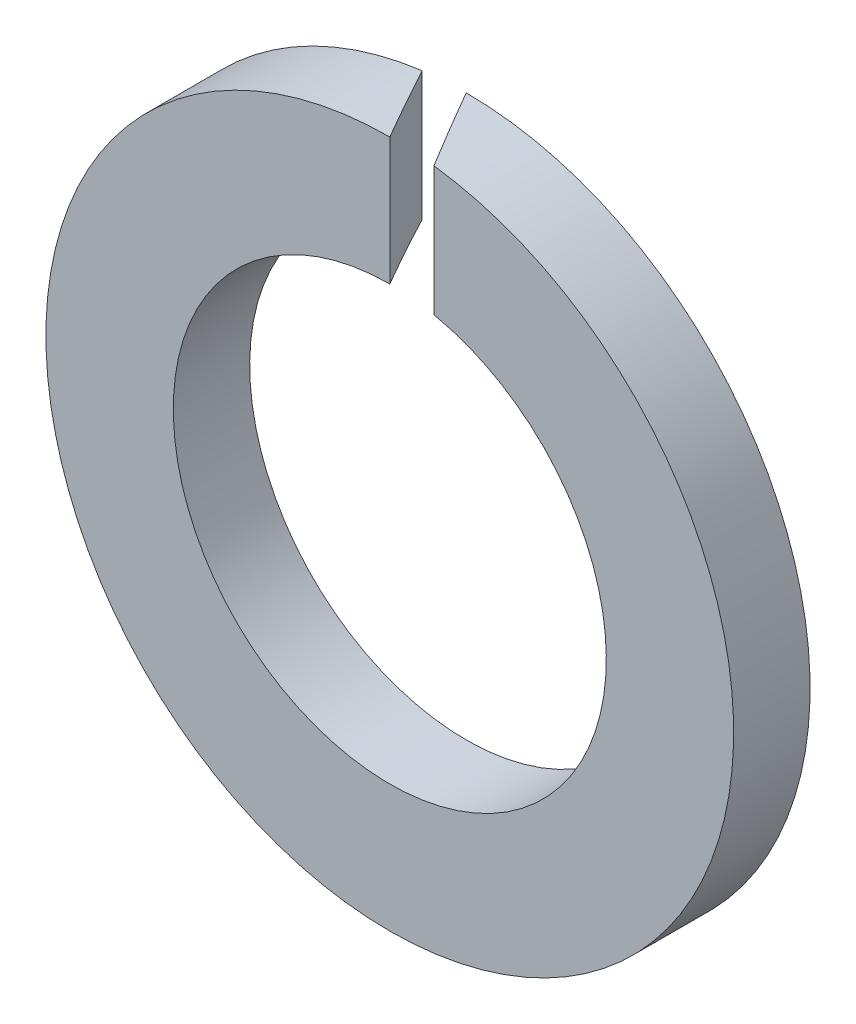
ISO-10303-21;
HEADER;
FILE_DESCRIPTION(('STEP AP214'),'2;1');
FILE_NAME('part.step','',(''),(''),'','','');
FILE_SCHEMA(('AUTOMOTIVE_DESIGN { 1 0 10303 214 1 1 1 1 }'));
ENDSEC;
DATA;
#1=APPLICATION_CONTEXT('core data for automotive mechanical design processes');
#2=APPLICATION_PROTOCOL_DEFINITION('international standard','automotive_design',2000,#1);
#3=PRODUCT_CONTEXT('',#1,'mechanical');
#4=PRODUCT('Part','Part','',(#3));
#5=PRODUCT_RELATED_PRODUCT_CATEGORY('part','',(#4));
#6=PRODUCT_DEFINITION_FORMATION('','',#4);
#7=PRODUCT_DEFINITION_CONTEXT('part definition',#1,'design');
#8=PRODUCT_DEFINITION('design','',#6,#7);
#9=PRODUCT_DEFINITION_SHAPE('','',#8);
#10=(LENGTH_UNIT() NAMED_UNIT(*) SI_UNIT(.MILLI.,.METRE.));
#11=(NAMED_UNIT(*) PLANE_ANGLE_UNIT() SI_UNIT($,.RADIAN.));
#12=(NAMED_UNIT(*) SI_UNIT($,.STERADIAN.) SOLID_ANGLE_UNIT());
#13=UNCERTAINTY_MEASURE_WITH_UNIT(LENGTH_MEASURE(1.E-05),#10,'distance_accuracy_value','');
#14=(GEOMETRIC_REPRESENTATION_CONTEXT(3) GLOBAL_UNCERTAINTY_ASSIGNED_CONTEXT((#13)) GLOBAL_UNIT_ASSIGNED_CONTEXT((#10,
#11,#12)) REPRESENTATION_CONTEXT('',''));
#15=CARTESIAN_POINT('',(0.,0.,0.));
#16=DIRECTION('',(0.,0.,1.));
#17=DIRECTION('',(1.,0.,0.));
#18=AXIS2_PLACEMENT_3D('',#15,#16,#17);
#19=CARTESIAN_POINT('',(0.,0.,-0.6));
#20=DIRECTION('',(0.,0.,1.));
#21=DIRECTION('',(1.,0.,0.));
#22=AXIS2_PLACEMENT_3D('',#19,#20,#21);
#23=CYLINDRICAL_SURFACE('',#22,2.7);
#24=CARTESIAN_POINT('',(0.,0.,0.));
#25=DIRECTION('',(0.,0.,1.));
#26=DIRECTION('',(1.,0.,0.));
#27=AXIS2_PLACEMENT_3D('',#24,#25,#26);
#28=CIRCLE('',#27,2.7);
#29=CARTESIAN_POINT('',(0.,2.7,0.));
#30=VERTEX_POINT('',#29);
#31=CARTESIAN_POINT('',(0.346410161513776,2.67768556779918,0.));
#32=VERTEX_POINT('',#31);
#33=EDGE_CURVE('E88',#30,#32,#28,.T.);
#34=ORIENTED_EDGE('',*,*,#33,.F.);
#35=CARTESIAN_POINT('',(0.,0.,0.));
#36=DIRECTION('',(0.866025403784439,0.,-0.5));
#37=DIRECTION('',(0.5,0.,0.866025403784439));
#38=AXIS2_PLACEMENT_3D('',#35,#36,#37);
#39=ELLIPSE('',#38,5.4,2.7);
#40=CARTESIAN_POINT('',(-0.346410161513775,2.67768556779918,-0.6));
#41=VERTEX_POINT('',#40);
#42=EDGE_CURVE('E72',#30,#41,#39,.F.);
#43=ORIENTED_EDGE('',*,*,#42,.T.);
#44=CARTESIAN_POINT('',(0.,0.,-0.6));
#45=DIRECTION('',(0.,0.,1.));
#46=DIRECTION('',(1.,0.,0.));
#47=AXIS2_PLACEMENT_3D('',#44,#45,#46);
#48=CIRCLE('',#47,2.7);
#49=CARTESIAN_POINT('',(0.,2.7,-0.6));
#50=VERTEX_POINT('',#49);
#51=EDGE_CURVE('E93',#41,#50,#48,.T.);
#52=ORIENTED_EDGE('',*,*,#51,.T.);
#53=CARTESIAN_POINT('',(0.,0.,-0.6));
#54=DIRECTION('',(-0.866025403784439,0.,0.5));
#55=DIRECTION('',(0.5,0.,0.866025403784439));
#56=AXIS2_PLACEMENT_3D('',#53,#54,#55);
#57=ELLIPSE('',#56,5.4,2.7);
#58=EDGE_CURVE('E81',#50,#32,#57,.F.);
#59=ORIENTED_EDGE('',*,*,#58,.T.);
#60=EDGE_LOOP('',(#34,#43,#52,#59));
#61=FACE_BOUND('',#60,.T.);
#62=ADVANCED_FACE('F35',(#61),#23,.T.);
#63=CARTESIAN_POINT('',(0.,0.,-0.6));
#64=DIRECTION('',(0.,0.,1.));
#65=DIRECTION('',(1.,0.,0.));
#66=AXIS2_PLACEMENT_3D('',#63,#64,#65);
#67=PLANE('',#66);
#68=DIRECTION('',(0.,-1.,0.));
#69=VECTOR('',#68,1.);
#70=CARTESIAN_POINT('',(-0.346410161513775,2.7,-0.6));
#71=LINE('',#70,#69);
#72=CARTESIAN_POINT('',(-0.346410161513775,1.66433169770933,-0.6));
#73=VERTEX_POINT('',#72);
#74=EDGE_CURVE('E75',#41,#73,#71,.T.);
#75=ORIENTED_EDGE('',*,*,#74,.T.);
#76=CARTESIAN_POINT('',(0.,0.,-0.6));
#77=DIRECTION('',(0.,0.,1.));
#78=DIRECTION('',(1.,0.,0.));
#79=AXIS2_PLACEMENT_3D('',#76,#77,#78);
#80=CIRCLE('',#79,1.7);
#81=CARTESIAN_POINT('',(0.,1.7,-0.6));
#82=VERTEX_POINT('',#81);
#83=EDGE_CURVE('E94',#73,#82,#80,.T.);
#84=ORIENTED_EDGE('',*,*,#83,.T.);
#85=DIRECTION('',(0.,-1.,0.));
#86=VECTOR('',#85,1.);
#87=CARTESIAN_POINT('',(0.,2.7,-0.6));
#88=LINE('',#87,#86);
#89=EDGE_CURVE('E56',#50,#82,#88,.T.);
#90=ORIENTED_EDGE('',*,*,#89,.F.);
#91=ORIENTED_EDGE('',*,*,#51,.F.);
#92=EDGE_LOOP('',(#75,#84,#90,#91));
#93=FACE_BOUND('',#92,.T.);
#94=ADVANCED_FACE('F109',(#93),#67,.F.);
#95=CARTESIAN_POINT('',(0.,0.,0.));
#96=DIRECTION('',(0.,0.,1.));
#97=DIRECTION('',(1.,0.,0.));
#98=AXIS2_PLACEMENT_3D('',#95,#96,#97);
#99=PLANE('',#98);
#100=CARTESIAN_POINT('',(0.,0.,0.));
#101=DIRECTION('',(0.,0.,1.));
#102=DIRECTION('',(1.,0.,0.));
#103=AXIS2_PLACEMENT_3D('',#100,#101,#102);
#104=CIRCLE('',#103,1.7);
#105=CARTESIAN_POINT('',(0.,1.7,0.));
#106=VERTEX_POINT('',#105);
#107=CARTESIAN_POINT('',(0.346410161513776,1.66433169770933,0.));
#108=VERTEX_POINT('',#107);
#109=EDGE_CURVE('E80',#106,#108,#104,.T.);
#110=ORIENTED_EDGE('',*,*,#109,.F.);
#111=DIRECTION('',(0.,-1.,0.));
#112=VECTOR('',#111,1.);
#113=CARTESIAN_POINT('',(0.,2.7,0.));
#114=LINE('',#113,#112);
#115=EDGE_CURVE('E48',#30,#106,#114,.T.);
#116=ORIENTED_EDGE('',*,*,#115,.F.);
#117=ORIENTED_EDGE('',*,*,#33,.T.);
#118=DIRECTION('',(0.,-1.,0.));
#119=VECTOR('',#118,1.);
#120=CARTESIAN_POINT('',(0.346410161513776,2.7,0.));
#121=LINE('',#120,#119);
#122=EDGE_CURVE('E90',#32,#108,#121,.T.);
#123=ORIENTED_EDGE('',*,*,#122,.T.);
#124=EDGE_LOOP('',(#110,#116,#117,#123));
#125=FACE_BOUND('',#124,.T.);
#126=ADVANCED_FACE('F86',(#125),#99,.T.);
#127=CARTESIAN_POINT('',(0.,0.,-0.6));
#128=DIRECTION('',(0.,0.,1.));
#129=DIRECTION('',(1.,0.,0.));
#130=AXIS2_PLACEMENT_3D('',#127,#128,#129);
#131=CYLINDRICAL_SURFACE('',#130,1.7);
#132=CARTESIAN_POINT('',(0.,0.,0.));
#133=DIRECTION('',(0.866025403784439,0.,-0.5));
#134=DIRECTION('',(0.5,0.,0.866025403784439));
#135=AXIS2_PLACEMENT_3D('',#132,#133,#134);
#136=ELLIPSE('',#135,3.4,1.7);
#137=EDGE_CURVE('E11',#106,#73,#136,.F.);
#138=ORIENTED_EDGE('',*,*,#137,.F.);
#139=ORIENTED_EDGE('',*,*,#109,.T.);
#140=CARTESIAN_POINT('',(0.,0.,-0.6));
#141=DIRECTION('',(-0.866025403784439,0.,0.5));
#142=DIRECTION('',(0.5,0.,0.866025403784439));
#143=AXIS2_PLACEMENT_3D('',#140,#141,#142);
#144=ELLIPSE('',#143,3.4,1.7);
#145=EDGE_CURVE('E42',#82,#108,#144,.F.);
#146=ORIENTED_EDGE('',*,*,#145,.F.);
#147=ORIENTED_EDGE('',*,*,#83,.F.);
#148=EDGE_LOOP('',(#138,#139,#146,#147));
#149=FACE_BOUND('',#148,.T.);
#150=ADVANCED_FACE('F104',(#149),#131,.F.);
#151=CARTESIAN_POINT('',(0.,2.7,-0.6));
#152=DIRECTION('',(-0.866025403784439,0.,0.5));
#153=DIRECTION('',(0.5,0.,0.866025403784439));
#154=AXIS2_PLACEMENT_3D('',#151,#152,#153);
#155=PLANE('',#154);
#156=ORIENTED_EDGE('',*,*,#89,.T.);
#157=ORIENTED_EDGE('',*,*,#145,.T.);
#158=ORIENTED_EDGE('',*,*,#122,.F.);
#159=ORIENTED_EDGE('',*,*,#58,.F.);
#160=EDGE_LOOP('',(#156,#157,#158,#159));
#161=FACE_BOUND('',#160,.T.);
#162=ADVANCED_FACE('F100',(#161),#155,.T.);
#163=CARTESIAN_POINT('',(0.,2.7,0.));
#164=DIRECTION('',(0.866025403784439,0.,-0.5));
#165=DIRECTION('',(-0.5,0.,-0.866025403784439));
#166=AXIS2_PLACEMENT_3D('',#163,#164,#165);
#167=PLANE('',#166);
#168=ORIENTED_EDGE('',*,*,#115,.T.);
#169=ORIENTED_EDGE('',*,*,#137,.T.);
#170=ORIENTED_EDGE('',*,*,#74,.F.);
#171=ORIENTED_EDGE('',*,*,#42,.F.);
#172=EDGE_LOOP('',(#168,#169,#170,#171));
#173=FACE_BOUND('',#172,.T.);
#174=ADVANCED_FACE('F73',(#173),#167,.T.);
#175=CLOSED_SHELL('',(#62,#94,#126,#150,#162,#174));
#176=MANIFOLD_SOLID_BREP('B2',#175);
#177=ADVANCED_BREP_SHAPE_REPRESENTATION('',(#18,#176),#14);
#178=SHAPE_DEFINITION_REPRESENTATION(#9,#177);
ENDSEC;
END-ISO-10303-21;
